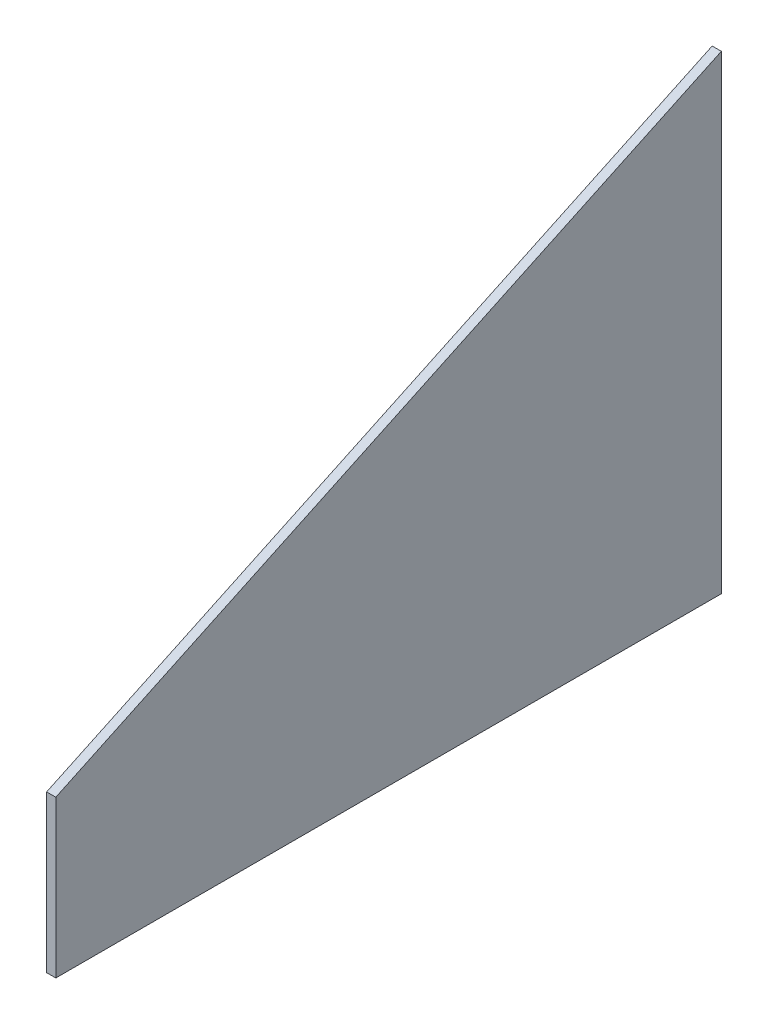
ISO-10303-21;
HEADER;
FILE_DESCRIPTION(('STEP AP214'),'2;1');
FILE_NAME('part.step','',(''),(''),'','','');
FILE_SCHEMA(('AUTOMOTIVE_DESIGN { 1 0 10303 214 1 1 1 1 }'));
ENDSEC;
DATA;
#1=APPLICATION_CONTEXT('core data for automotive mechanical design processes');
#2=APPLICATION_PROTOCOL_DEFINITION('international standard','automotive_design',2000,#1);
#3=PRODUCT_CONTEXT('',#1,'mechanical');
#4=PRODUCT('Part','Part','',(#3));
#5=PRODUCT_RELATED_PRODUCT_CATEGORY('part','',(#4));
#6=PRODUCT_DEFINITION_FORMATION('','',#4);
#7=PRODUCT_DEFINITION_CONTEXT('part definition',#1,'design');
#8=PRODUCT_DEFINITION('design','',#6,#7);
#9=PRODUCT_DEFINITION_SHAPE('','',#8);
#10=(LENGTH_UNIT() NAMED_UNIT(*) SI_UNIT(.MILLI.,.METRE.));
#11=(NAMED_UNIT(*) PLANE_ANGLE_UNIT() SI_UNIT($,.RADIAN.));
#12=(NAMED_UNIT(*) SI_UNIT($,.STERADIAN.) SOLID_ANGLE_UNIT());
#13=UNCERTAINTY_MEASURE_WITH_UNIT(LENGTH_MEASURE(1.E-05),#10,'distance_accuracy_value','');
#14=(GEOMETRIC_REPRESENTATION_CONTEXT(3) GLOBAL_UNCERTAINTY_ASSIGNED_CONTEXT((#13)) GLOBAL_UNIT_ASSIGNED_CONTEXT((#10,
#11,#12)) REPRESENTATION_CONTEXT('',''));
#15=CARTESIAN_POINT('',(0.,0.,0.));
#16=DIRECTION('',(0.,0.,1.));
#17=DIRECTION('',(1.,0.,0.));
#18=AXIS2_PLACEMENT_3D('',#15,#16,#17);
#19=CARTESIAN_POINT('',(11.90625,0.,-863.6));
#20=DIRECTION('',(0.,0.,1.));
#21=DIRECTION('',(1.,0.,0.));
#22=AXIS2_PLACEMENT_3D('',#19,#20,#21);
#23=PLANE('',#22);
#24=DIRECTION('',(0.,1.,0.));
#25=VECTOR('',#24,1.);
#26=CARTESIAN_POINT('',(0.,0.,-863.6));
#27=LINE('',#26,#25);
#28=CARTESIAN_POINT('',(0.,0.,-863.6));
#29=VERTEX_POINT('',#28);
#30=CARTESIAN_POINT('',(0.,609.6,-863.6));
#31=VERTEX_POINT('',#30);
#32=EDGE_CURVE('E112',#29,#31,#27,.T.);
#33=ORIENTED_EDGE('',*,*,#32,.T.);
#34=DIRECTION('',(-1.,0.,0.));
#35=VECTOR('',#34,1.);
#36=CARTESIAN_POINT('',(11.90625,609.6,-863.6));
#37=LINE('',#36,#35);
#38=CARTESIAN_POINT('',(11.90625,609.6,-863.6));
#39=VERTEX_POINT('',#38);
#40=EDGE_CURVE('E11',#39,#31,#37,.T.);
#41=ORIENTED_EDGE('',*,*,#40,.F.);
#42=DIRECTION('',(0.,1.,0.));
#43=VECTOR('',#42,1.);
#44=CARTESIAN_POINT('',(11.90625,0.,-863.6));
#45=LINE('',#44,#43);
#46=CARTESIAN_POINT('',(11.90625,0.,-863.6));
#47=VERTEX_POINT('',#46);
#48=EDGE_CURVE('E93',#47,#39,#45,.T.);
#49=ORIENTED_EDGE('',*,*,#48,.F.);
#50=DIRECTION('',(-1.,0.,0.));
#51=VECTOR('',#50,1.);
#52=CARTESIAN_POINT('',(11.90625,0.,-863.6));
#53=LINE('',#52,#51);
#54=EDGE_CURVE('E108',#47,#29,#53,.T.);
#55=ORIENTED_EDGE('',*,*,#54,.T.);
#56=EDGE_LOOP('',(#33,#41,#49,#55));
#57=FACE_BOUND('',#56,.T.);
#58=ADVANCED_FACE('F45',(#57),#23,.F.);
#59=CARTESIAN_POINT('',(11.90625,609.6,-863.6));
#60=DIRECTION('',(0.,-0.904818702200994,-0.42579703632988));
#61=DIRECTION('',(0.,0.42579703632988,-0.904818702200994));
#62=AXIS2_PLACEMENT_3D('',#59,#60,#61);
#63=PLANE('',#62);
#64=DIRECTION('',(0.,-0.42579703632988,0.904818702200994));
#65=VECTOR('',#64,1.);
#66=CARTESIAN_POINT('',(0.,609.6,-863.6));
#67=LINE('',#66,#65);
#68=CARTESIAN_POINT('',(0.,203.2,0.));
#69=VERTEX_POINT('',#68);
#70=EDGE_CURVE('E99',#31,#69,#67,.T.);
#71=ORIENTED_EDGE('',*,*,#70,.T.);
#72=DIRECTION('',(-1.,0.,0.));
#73=VECTOR('',#72,1.);
#74=CARTESIAN_POINT('',(11.90625,203.2,0.));
#75=LINE('',#74,#73);
#76=CARTESIAN_POINT('',(11.90625,203.2,0.));
#77=VERTEX_POINT('',#76);
#78=EDGE_CURVE('E54',#77,#69,#75,.T.);
#79=ORIENTED_EDGE('',*,*,#78,.F.);
#80=DIRECTION('',(0.,-0.42579703632988,0.904818702200994));
#81=VECTOR('',#80,1.);
#82=CARTESIAN_POINT('',(11.90625,609.6,-863.6));
#83=LINE('',#82,#81);
#84=EDGE_CURVE('E88',#39,#77,#83,.T.);
#85=ORIENTED_EDGE('',*,*,#84,.F.);
#86=ORIENTED_EDGE('',*,*,#40,.T.);
#87=EDGE_LOOP('',(#71,#79,#85,#86));
#88=FACE_BOUND('',#87,.T.);
#89=ADVANCED_FACE('F98',(#88),#63,.F.);
#90=CARTESIAN_POINT('',(11.90625,0.,0.));
#91=DIRECTION('',(0.,0.,1.));
#92=DIRECTION('',(1.,0.,0.));
#93=AXIS2_PLACEMENT_3D('',#90,#91,#92);
#94=PLANE('',#93);
#95=DIRECTION('',(0.,1.,0.));
#96=VECTOR('',#95,1.);
#97=CARTESIAN_POINT('',(0.,0.,0.));
#98=LINE('',#97,#96);
#99=CARTESIAN_POINT('',(0.,0.,0.));
#100=VERTEX_POINT('',#99);
#101=EDGE_CURVE('E118',#100,#69,#98,.T.);
#102=ORIENTED_EDGE('',*,*,#101,.F.);
#103=DIRECTION('',(-1.,0.,0.));
#104=VECTOR('',#103,1.);
#105=CARTESIAN_POINT('',(11.90625,0.,0.));
#106=LINE('',#105,#104);
#107=CARTESIAN_POINT('',(11.90625,0.,0.));
#108=VERTEX_POINT('',#107);
#109=EDGE_CURVE('E78',#108,#100,#106,.T.);
#110=ORIENTED_EDGE('',*,*,#109,.F.);
#111=DIRECTION('',(0.,1.,0.));
#112=VECTOR('',#111,1.);
#113=CARTESIAN_POINT('',(11.90625,0.,0.));
#114=LINE('',#113,#112);
#115=EDGE_CURVE('E91',#108,#77,#114,.T.);
#116=ORIENTED_EDGE('',*,*,#115,.T.);
#117=ORIENTED_EDGE('',*,*,#78,.T.);
#118=EDGE_LOOP('',(#102,#110,#116,#117));
#119=FACE_BOUND('',#118,.T.);
#120=ADVANCED_FACE('F104',(#119),#94,.T.);
#121=CARTESIAN_POINT('',(11.90625,0.,0.));
#122=DIRECTION('',(0.,1.,0.));
#123=DIRECTION('',(0.,0.,1.));
#124=AXIS2_PLACEMENT_3D('',#121,#122,#123);
#125=PLANE('',#124);
#126=DIRECTION('',(0.,0.,-1.));
#127=VECTOR('',#126,1.);
#128=CARTESIAN_POINT('',(0.,0.,0.));
#129=LINE('',#128,#127);
#130=EDGE_CURVE('E81',#100,#29,#129,.T.);
#131=ORIENTED_EDGE('',*,*,#130,.T.);
#132=ORIENTED_EDGE('',*,*,#54,.F.);
#133=DIRECTION('',(0.,0.,-1.));
#134=VECTOR('',#133,1.);
#135=CARTESIAN_POINT('',(11.90625,0.,0.));
#136=LINE('',#135,#134);
#137=EDGE_CURVE('E62',#108,#47,#136,.T.);
#138=ORIENTED_EDGE('',*,*,#137,.F.);
#139=ORIENTED_EDGE('',*,*,#109,.T.);
#140=EDGE_LOOP('',(#131,#132,#138,#139));
#141=FACE_BOUND('',#140,.T.);
#142=ADVANCED_FACE('F135',(#141),#125,.F.);
#143=CARTESIAN_POINT('',(11.90625,0.,0.));
#144=DIRECTION('',(-1.,0.,0.));
#145=DIRECTION('',(0.,0.,1.));
#146=AXIS2_PLACEMENT_3D('',#143,#144,#145);
#147=PLANE('',#146);
#148=ORIENTED_EDGE('',*,*,#48,.T.);
#149=ORIENTED_EDGE('',*,*,#84,.T.);
#150=ORIENTED_EDGE('',*,*,#115,.F.);
#151=ORIENTED_EDGE('',*,*,#137,.T.);
#152=EDGE_LOOP('',(#148,#149,#150,#151));
#153=FACE_BOUND('',#152,.T.);
#154=ADVANCED_FACE('F89',(#153),#147,.F.);
#155=CARTESIAN_POINT('',(0.,0.,0.));
#156=DIRECTION('',(-1.,0.,0.));
#157=DIRECTION('',(0.,0.,1.));
#158=AXIS2_PLACEMENT_3D('',#155,#156,#157);
#159=PLANE('',#158);
#160=ORIENTED_EDGE('',*,*,#32,.F.);
#161=ORIENTED_EDGE('',*,*,#130,.F.);
#162=ORIENTED_EDGE('',*,*,#101,.T.);
#163=ORIENTED_EDGE('',*,*,#70,.F.);
#164=EDGE_LOOP('',(#160,#161,#162,#163));
#165=FACE_BOUND('',#164,.T.);
#166=ADVANCED_FACE('F129',(#165),#159,.T.);
#167=CLOSED_SHELL('',(#58,#89,#120,#142,#154,#166));
#168=MANIFOLD_SOLID_BREP('B2',#167);
#169=ADVANCED_BREP_SHAPE_REPRESENTATION('',(#18,#168),#14);
#170=SHAPE_DEFINITION_REPRESENTATION(#9,#169);
ENDSEC;
END-ISO-10303-21;
